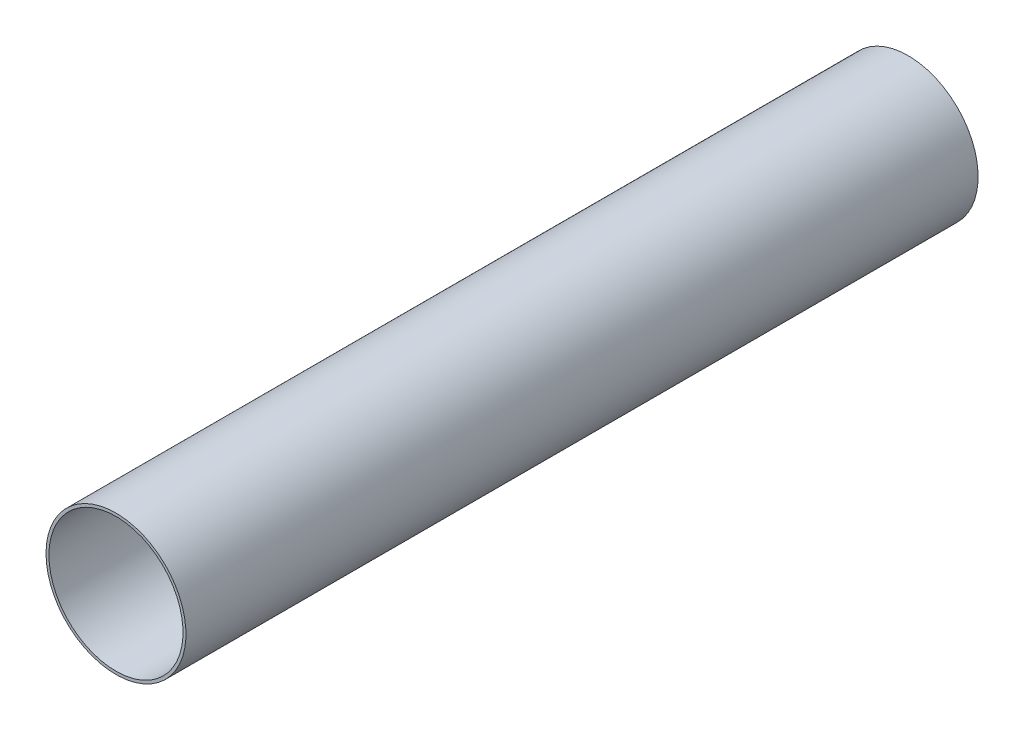
ISO-10303-21;
HEADER;
FILE_DESCRIPTION(('STEP AP214'),'2;1');
FILE_NAME('part.step','',(''),(''),'','','');
FILE_SCHEMA(('AUTOMOTIVE_DESIGN { 1 0 10303 214 1 1 1 1 }'));
ENDSEC;
DATA;
#1=APPLICATION_CONTEXT('core data for automotive mechanical design processes');
#2=APPLICATION_PROTOCOL_DEFINITION('international standard','automotive_design',2000,#1);
#3=PRODUCT_CONTEXT('',#1,'mechanical');
#4=PRODUCT('Part','Part','',(#3));
#5=PRODUCT_RELATED_PRODUCT_CATEGORY('part','',(#4));
#6=PRODUCT_DEFINITION_FORMATION('','',#4);
#7=PRODUCT_DEFINITION_CONTEXT('part definition',#1,'design');
#8=PRODUCT_DEFINITION('design','',#6,#7);
#9=PRODUCT_DEFINITION_SHAPE('','',#8);
#10=(LENGTH_UNIT() NAMED_UNIT(*) SI_UNIT(.MILLI.,.METRE.));
#11=(NAMED_UNIT(*) PLANE_ANGLE_UNIT() SI_UNIT($,.RADIAN.));
#12=(NAMED_UNIT(*) SI_UNIT($,.STERADIAN.) SOLID_ANGLE_UNIT());
#13=UNCERTAINTY_MEASURE_WITH_UNIT(LENGTH_MEASURE(1.E-05),#10,'distance_accuracy_value','');
#14=(GEOMETRIC_REPRESENTATION_CONTEXT(3) GLOBAL_UNCERTAINTY_ASSIGNED_CONTEXT((#13)) GLOBAL_UNIT_ASSIGNED_CONTEXT((#10,
#11,#12)) REPRESENTATION_CONTEXT('',''));
#15=CARTESIAN_POINT('',(0.,0.,0.));
#16=DIRECTION('',(0.,0.,1.));
#17=DIRECTION('',(1.,0.,0.));
#18=AXIS2_PLACEMENT_3D('',#15,#16,#17);
#19=CARTESIAN_POINT('',(0.,0.,450.85));
#20=DIRECTION('',(0.,0.,1.));
#21=DIRECTION('',(1.,0.,0.));
#22=AXIS2_PLACEMENT_3D('',#19,#20,#21);
#23=PLANE('',#22);
#24=CARTESIAN_POINT('',(0.,0.,450.85));
#25=DIRECTION('',(0.,0.,1.));
#26=DIRECTION('',(1.,0.,0.));
#27=AXIS2_PLACEMENT_3D('',#24,#25,#26);
#28=CIRCLE('',#27,39.8145);
#29=CARTESIAN_POINT('',(-39.8145,0.,450.85));
#30=VERTEX_POINT('',#29);
#31=EDGE_CURVE('E10',#30,#30,#28,.T.);
#32=ORIENTED_EDGE('',*,*,#31,.T.);
#33=EDGE_LOOP('',(#32));
#34=FACE_BOUND('',#33,.T.);
#35=CARTESIAN_POINT('',(0.,0.,450.85));
#36=DIRECTION('',(0.,0.,1.));
#37=DIRECTION('',(1.,0.,0.));
#38=AXIS2_PLACEMENT_3D('',#35,#36,#37);
#39=CIRCLE('',#38,38.1635);
#40=CARTESIAN_POINT('',(-38.1635,0.,450.85));
#41=VERTEX_POINT('',#40);
#42=EDGE_CURVE('E44',#41,#41,#39,.T.);
#43=ORIENTED_EDGE('',*,*,#42,.F.);
#44=EDGE_LOOP('',(#43));
#45=FACE_BOUND('',#44,.T.);
#46=ADVANCED_FACE('F33',(#34,#45),#23,.T.);
#47=CARTESIAN_POINT('',(0.,0.,0.));
#48=DIRECTION('',(0.,0.,1.));
#49=DIRECTION('',(1.,0.,0.));
#50=AXIS2_PLACEMENT_3D('',#47,#48,#49);
#51=PLANE('',#50);
#52=CARTESIAN_POINT('',(0.,0.,0.));
#53=DIRECTION('',(0.,0.,1.));
#54=DIRECTION('',(1.,0.,0.));
#55=AXIS2_PLACEMENT_3D('',#52,#53,#54);
#56=CIRCLE('',#55,39.8145);
#57=CARTESIAN_POINT('',(-39.8145,0.,0.));
#58=VERTEX_POINT('',#57);
#59=EDGE_CURVE('E37',#58,#58,#56,.T.);
#60=ORIENTED_EDGE('',*,*,#59,.F.);
#61=EDGE_LOOP('',(#60));
#62=FACE_BOUND('',#61,.T.);
#63=CARTESIAN_POINT('',(0.,0.,0.));
#64=DIRECTION('',(0.,0.,1.));
#65=DIRECTION('',(1.,0.,0.));
#66=AXIS2_PLACEMENT_3D('',#63,#64,#65);
#67=CIRCLE('',#66,38.1635);
#68=CARTESIAN_POINT('',(-38.1635,0.,0.));
#69=VERTEX_POINT('',#68);
#70=EDGE_CURVE('E46',#69,#69,#67,.T.);
#71=ORIENTED_EDGE('',*,*,#70,.T.);
#72=EDGE_LOOP('',(#71));
#73=FACE_BOUND('',#72,.T.);
#74=ADVANCED_FACE('F56',(#62,#73),#51,.F.);
#75=CARTESIAN_POINT('',(0.,0.,450.85));
#76=DIRECTION('',(0.,0.,-1.));
#77=DIRECTION('',(-1.,0.,0.));
#78=AXIS2_PLACEMENT_3D('',#75,#76,#77);
#79=CYLINDRICAL_SURFACE('',#78,39.8145);
#80=CARTESIAN_POINT('',(-39.8145,0.,450.85));
#81=CARTESIAN_POINT('',(-39.8145,0.,446.153645833333));
#82=CARTESIAN_POINT('',(-39.8145,0.,441.457291666667));
#83=CARTESIAN_POINT('',(-39.8145,0.,432.064583333333));
#84=CARTESIAN_POINT('',(-39.8145,0.,427.368229166667));
#85=CARTESIAN_POINT('',(-39.8145,0.,417.975520833333));
#86=CARTESIAN_POINT('',(-39.8145,0.,413.279166666667));
#87=CARTESIAN_POINT('',(-39.8145,0.,403.886458333333));
#88=CARTESIAN_POINT('',(-39.8145,0.,399.190104166667));
#89=CARTESIAN_POINT('',(-39.8145,0.,389.797395833333));
#90=CARTESIAN_POINT('',(-39.8145,0.,385.101041666667));
#91=CARTESIAN_POINT('',(-39.8145,0.,375.708333333333));
#92=CARTESIAN_POINT('',(-39.8145,0.,371.011979166667));
#93=CARTESIAN_POINT('',(-39.8145,0.,361.619270833333));
#94=CARTESIAN_POINT('',(-39.8145,0.,356.922916666667));
#95=CARTESIAN_POINT('',(-39.8145,0.,347.530208333333));
#96=CARTESIAN_POINT('',(-39.8145,0.,342.833854166667));
#97=CARTESIAN_POINT('',(-39.8145,0.,333.441145833333));
#98=CARTESIAN_POINT('',(-39.8145,0.,328.744791666667));
#99=CARTESIAN_POINT('',(-39.8145,0.,319.352083333333));
#100=CARTESIAN_POINT('',(-39.8145,0.,314.655729166667));
#101=CARTESIAN_POINT('',(-39.8145,0.,305.263020833333));
#102=CARTESIAN_POINT('',(-39.8145,0.,300.566666666667));
#103=CARTESIAN_POINT('',(-39.8145,0.,291.173958333333));
#104=CARTESIAN_POINT('',(-39.8145,0.,286.477604166667));
#105=CARTESIAN_POINT('',(-39.8145,0.,277.084895833333));
#106=CARTESIAN_POINT('',(-39.8145,0.,272.388541666667));
#107=CARTESIAN_POINT('',(-39.8145,0.,262.995833333333));
#108=CARTESIAN_POINT('',(-39.8145,0.,258.299479166667));
#109=CARTESIAN_POINT('',(-39.8145,0.,248.906770833333));
#110=CARTESIAN_POINT('',(-39.8145,0.,244.210416666667));
#111=CARTESIAN_POINT('',(-39.8145,0.,234.817708333333));
#112=CARTESIAN_POINT('',(-39.8145,0.,230.121354166667));
#113=CARTESIAN_POINT('',(-39.8145,0.,220.728645833333));
#114=CARTESIAN_POINT('',(-39.8145,0.,216.032291666667));
#115=CARTESIAN_POINT('',(-39.8145,0.,206.639583333333));
#116=CARTESIAN_POINT('',(-39.8145,0.,201.943229166667));
#117=CARTESIAN_POINT('',(-39.8145,0.,192.550520833333));
#118=CARTESIAN_POINT('',(-39.8145,0.,187.854166666667));
#119=CARTESIAN_POINT('',(-39.8145,0.,178.461458333333));
#120=CARTESIAN_POINT('',(-39.8145,0.,173.765104166667));
#121=CARTESIAN_POINT('',(-39.8145,0.,164.372395833333));
#122=CARTESIAN_POINT('',(-39.8145,0.,159.676041666667));
#123=CARTESIAN_POINT('',(-39.8145,0.,150.283333333333));
#124=CARTESIAN_POINT('',(-39.8145,0.,145.586979166667));
#125=CARTESIAN_POINT('',(-39.8145,0.,136.194270833333));
#126=CARTESIAN_POINT('',(-39.8145,0.,131.497916666667));
#127=CARTESIAN_POINT('',(-39.8145,0.,122.105208333333));
#128=CARTESIAN_POINT('',(-39.8145,0.,117.408854166667));
#129=CARTESIAN_POINT('',(-39.8145,0.,108.016145833333));
#130=CARTESIAN_POINT('',(-39.8145,0.,103.319791666667));
#131=CARTESIAN_POINT('',(-39.8145,0.,93.9270833333333));
#132=CARTESIAN_POINT('',(-39.8145,0.,89.2307291666666));
#133=CARTESIAN_POINT('',(-39.8145,0.,79.8380208333333));
#134=CARTESIAN_POINT('',(-39.8145,0.,75.1416666666666));
#135=CARTESIAN_POINT('',(-39.8145,0.,65.7489583333333));
#136=CARTESIAN_POINT('',(-39.8145,0.,61.0526041666666));
#137=CARTESIAN_POINT('',(-39.8145,0.,51.6598958333333));
#138=CARTESIAN_POINT('',(-39.8145,0.,46.9635416666666));
#139=CARTESIAN_POINT('',(-39.8145,0.,37.5708333333333));
#140=CARTESIAN_POINT('',(-39.8145,0.,32.8744791666666));
#141=CARTESIAN_POINT('',(-39.8145,0.,23.4817708333333));
#142=CARTESIAN_POINT('',(-39.8145,0.,18.7854166666666));
#143=CARTESIAN_POINT('',(-39.8145,0.,9.39270833333329));
#144=CARTESIAN_POINT('',(-39.8145,0.,4.69635416666661));
#145=CARTESIAN_POINT('',(-39.8145,0.,0.));
#146=B_SPLINE_CURVE_WITH_KNOTS('',3,(#80,#81,#82,#83,#84,#85,#86,#87,#88,#89,#90,#91,#92,#93,
#94,#95,#96,#97,#98,#99,#100,#101,#102,#103,#104,#105,#106,#107,#108,#109,#110,#111,#112,#113,
#114,#115,#116,#117,#118,#119,#120,#121,#122,#123,#124,#125,#126,#127,#128,#129,#130,#131,#132,
#133,#134,#135,#136,#137,#138,#139,#140,#141,#142,#143,#144,#145),.UNSPECIFIED.,.F.,.F.,(4,2,2,
2,2,2,2,2,2,2,2,2,2,2,2,2,2,2,2,2,2,2,2,2,2,2,2,2,2,2,2,2,4),(0.,14.0890625,28.178125,
42.2671875,56.3562499999999,70.4453125,84.534375,98.6234375,112.7125,126.8015625,140.890625,
154.9796875,169.06875,183.1578125,197.246875,211.3359375,225.425,239.5140625,253.603125,
267.6921875,281.78125,295.8703125,309.959375,324.0484375,338.1375,352.2265625,366.315625,
380.4046875,394.49375,408.5828125,422.671875,436.7609375,450.85),.UNSPECIFIED.);
#147=EDGE_CURVE('BSEAM35',#30,#58,#146,.T.);
#148=ORIENTED_EDGE('',*,*,#31,.F.);
#149=ORIENTED_EDGE('',*,*,#59,.T.);
#150=ORIENTED_EDGE('',*,*,#147,.T.);
#151=ORIENTED_EDGE('',*,*,#147,.F.);
#152=EDGE_LOOP('',(#148,#150,#149,#151));
#153=FACE_BOUND('',#152,.T.);
#154=ADVANCED_FACE('F35',(#153),#79,.T.);
#155=CARTESIAN_POINT('',(0.,0.,450.85));
#156=DIRECTION('',(0.,0.,-1.));
#157=DIRECTION('',(-1.,0.,0.));
#158=AXIS2_PLACEMENT_3D('',#155,#156,#157);
#159=CYLINDRICAL_SURFACE('',#158,38.1635);
#160=CARTESIAN_POINT('',(-38.1635,0.,450.85));
#161=CARTESIAN_POINT('',(-38.1635,0.,446.153645833333));
#162=CARTESIAN_POINT('',(-38.1635,0.,441.457291666667));
#163=CARTESIAN_POINT('',(-38.1635,0.,432.064583333333));
#164=CARTESIAN_POINT('',(-38.1635,0.,427.368229166667));
#165=CARTESIAN_POINT('',(-38.1635,0.,417.975520833333));
#166=CARTESIAN_POINT('',(-38.1635,0.,413.279166666667));
#167=CARTESIAN_POINT('',(-38.1635,0.,403.886458333333));
#168=CARTESIAN_POINT('',(-38.1635,0.,399.190104166667));
#169=CARTESIAN_POINT('',(-38.1635,0.,389.797395833333));
#170=CARTESIAN_POINT('',(-38.1635,0.,385.101041666667));
#171=CARTESIAN_POINT('',(-38.1635,0.,375.708333333333));
#172=CARTESIAN_POINT('',(-38.1635,0.,371.011979166667));
#173=CARTESIAN_POINT('',(-38.1635,0.,361.619270833333));
#174=CARTESIAN_POINT('',(-38.1635,0.,356.922916666667));
#175=CARTESIAN_POINT('',(-38.1635,0.,347.530208333333));
#176=CARTESIAN_POINT('',(-38.1635,0.,342.833854166667));
#177=CARTESIAN_POINT('',(-38.1635,0.,333.441145833333));
#178=CARTESIAN_POINT('',(-38.1635,0.,328.744791666667));
#179=CARTESIAN_POINT('',(-38.1635,0.,319.352083333333));
#180=CARTESIAN_POINT('',(-38.1635,0.,314.655729166667));
#181=CARTESIAN_POINT('',(-38.1635,0.,305.263020833333));
#182=CARTESIAN_POINT('',(-38.1635,0.,300.566666666667));
#183=CARTESIAN_POINT('',(-38.1635,0.,291.173958333333));
#184=CARTESIAN_POINT('',(-38.1635,0.,286.477604166667));
#185=CARTESIAN_POINT('',(-38.1635,0.,277.084895833333));
#186=CARTESIAN_POINT('',(-38.1635,0.,272.388541666667));
#187=CARTESIAN_POINT('',(-38.1635,0.,262.995833333333));
#188=CARTESIAN_POINT('',(-38.1635,0.,258.299479166667));
#189=CARTESIAN_POINT('',(-38.1635,0.,248.906770833333));
#190=CARTESIAN_POINT('',(-38.1635,0.,244.210416666667));
#191=CARTESIAN_POINT('',(-38.1635,0.,234.817708333333));
#192=CARTESIAN_POINT('',(-38.1635,0.,230.121354166667));
#193=CARTESIAN_POINT('',(-38.1635,0.,220.728645833333));
#194=CARTESIAN_POINT('',(-38.1635,0.,216.032291666667));
#195=CARTESIAN_POINT('',(-38.1635,0.,206.639583333333));
#196=CARTESIAN_POINT('',(-38.1635,0.,201.943229166667));
#197=CARTESIAN_POINT('',(-38.1635,0.,192.550520833333));
#198=CARTESIAN_POINT('',(-38.1635,0.,187.854166666667));
#199=CARTESIAN_POINT('',(-38.1635,0.,178.461458333333));
#200=CARTESIAN_POINT('',(-38.1635,0.,173.765104166667));
#201=CARTESIAN_POINT('',(-38.1635,0.,164.372395833333));
#202=CARTESIAN_POINT('',(-38.1635,0.,159.676041666667));
#203=CARTESIAN_POINT('',(-38.1635,0.,150.283333333333));
#204=CARTESIAN_POINT('',(-38.1635,0.,145.586979166667));
#205=CARTESIAN_POINT('',(-38.1635,0.,136.194270833333));
#206=CARTESIAN_POINT('',(-38.1635,0.,131.497916666667));
#207=CARTESIAN_POINT('',(-38.1635,0.,122.105208333333));
#208=CARTESIAN_POINT('',(-38.1635,0.,117.408854166667));
#209=CARTESIAN_POINT('',(-38.1635,0.,108.016145833333));
#210=CARTESIAN_POINT('',(-38.1635,0.,103.319791666667));
#211=CARTESIAN_POINT('',(-38.1635,0.,93.9270833333333));
#212=CARTESIAN_POINT('',(-38.1635,0.,89.2307291666666));
#213=CARTESIAN_POINT('',(-38.1635,0.,79.8380208333333));
#214=CARTESIAN_POINT('',(-38.1635,0.,75.1416666666666));
#215=CARTESIAN_POINT('',(-38.1635,0.,65.7489583333333));
#216=CARTESIAN_POINT('',(-38.1635,0.,61.0526041666666));
#217=CARTESIAN_POINT('',(-38.1635,0.,51.6598958333333));
#218=CARTESIAN_POINT('',(-38.1635,0.,46.9635416666666));
#219=CARTESIAN_POINT('',(-38.1635,0.,37.5708333333333));
#220=CARTESIAN_POINT('',(-38.1635,0.,32.8744791666666));
#221=CARTESIAN_POINT('',(-38.1635,0.,23.4817708333333));
#222=CARTESIAN_POINT('',(-38.1635,0.,18.7854166666666));
#223=CARTESIAN_POINT('',(-38.1635,0.,9.39270833333329));
#224=CARTESIAN_POINT('',(-38.1635,0.,4.69635416666661));
#225=CARTESIAN_POINT('',(-38.1635,0.,0.));
#226=B_SPLINE_CURVE_WITH_KNOTS('',3,(#160,#161,#162,#163,#164,#165,#166,#167,#168,#169,#170,
#171,#172,#173,#174,#175,#176,#177,#178,#179,#180,#181,#182,#183,#184,#185,#186,#187,#188,#189,
#190,#191,#192,#193,#194,#195,#196,#197,#198,#199,#200,#201,#202,#203,#204,#205,#206,#207,#208,
#209,#210,#211,#212,#213,#214,#215,#216,#217,#218,#219,#220,#221,#222,#223,#224,#225),
.UNSPECIFIED.,.F.,.F.,(4,2,2,2,2,2,2,2,2,2,2,2,2,2,2,2,2,2,2,2,2,2,2,2,2,2,2,2,2,2,2,2,4),(0.,
14.0890625,28.178125,42.2671875,56.3562499999999,70.4453125,84.534375,98.6234375,112.7125,
126.8015625,140.890625,154.9796875,169.06875,183.1578125,197.246875,211.3359375,225.425,
239.5140625,253.603125,267.6921875,281.78125,295.8703125,309.959375,324.0484375,338.1375,
352.2265625,366.315625,380.4046875,394.49375,408.5828125,422.671875,436.7609375,450.85),.UNSPECIFIED.);
#227=EDGE_CURVE('BSEAM52',#41,#69,#226,.T.);
#228=ORIENTED_EDGE('',*,*,#42,.T.);
#229=ORIENTED_EDGE('',*,*,#70,.F.);
#230=ORIENTED_EDGE('',*,*,#227,.T.);
#231=ORIENTED_EDGE('',*,*,#227,.F.);
#232=EDGE_LOOP('',(#228,#230,#229,#231));
#233=FACE_BOUND('',#232,.T.);
#234=ADVANCED_FACE('F52',(#233),#159,.F.);
#235=CLOSED_SHELL('',(#46,#74,#154,#234));
#236=MANIFOLD_SOLID_BREP('B2',#235);
#237=ADVANCED_BREP_SHAPE_REPRESENTATION('',(#18,#236),#14);
#238=SHAPE_DEFINITION_REPRESENTATION(#9,#237);
ENDSEC;
END-ISO-10303-21;
